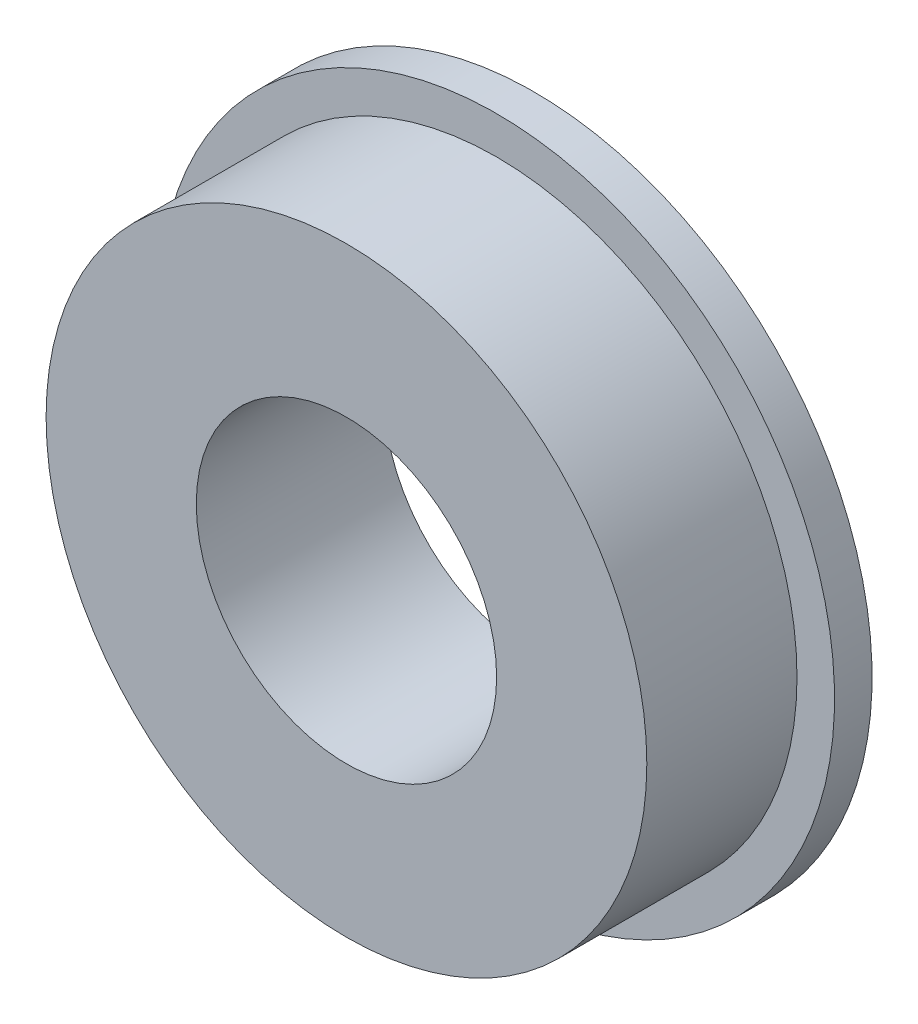
ISO-10303-21;
HEADER;
FILE_DESCRIPTION(('STEP AP214'),'2;1');
FILE_NAME('part.step','',(''),(''),'','','');
FILE_SCHEMA(('AUTOMOTIVE_DESIGN { 1 0 10303 214 1 1 1 1 }'));
ENDSEC;
DATA;
#1=APPLICATION_CONTEXT('core data for automotive mechanical design processes');
#2=APPLICATION_PROTOCOL_DEFINITION('international standard','automotive_design',2000,#1);
#3=PRODUCT_CONTEXT('',#1,'mechanical');
#4=PRODUCT('Part','Part','',(#3));
#5=PRODUCT_RELATED_PRODUCT_CATEGORY('part','',(#4));
#6=PRODUCT_DEFINITION_FORMATION('','',#4);
#7=PRODUCT_DEFINITION_CONTEXT('part definition',#1,'design');
#8=PRODUCT_DEFINITION('design','',#6,#7);
#9=PRODUCT_DEFINITION_SHAPE('','',#8);
#10=(LENGTH_UNIT() NAMED_UNIT(*) SI_UNIT(.MILLI.,.METRE.));
#11=(NAMED_UNIT(*) PLANE_ANGLE_UNIT() SI_UNIT($,.RADIAN.));
#12=(NAMED_UNIT(*) SI_UNIT($,.STERADIAN.) SOLID_ANGLE_UNIT());
#13=UNCERTAINTY_MEASURE_WITH_UNIT(LENGTH_MEASURE(1.E-05),#10,'distance_accuracy_value','');
#14=(GEOMETRIC_REPRESENTATION_CONTEXT(3) GLOBAL_UNCERTAINTY_ASSIGNED_CONTEXT((#13)) GLOBAL_UNIT_ASSIGNED_CONTEXT((#10,
#11,#12)) REPRESENTATION_CONTEXT('',''));
#15=CARTESIAN_POINT('',(0.,0.,0.));
#16=DIRECTION('',(0.,0.,1.));
#17=DIRECTION('',(1.,0.,0.));
#18=AXIS2_PLACEMENT_3D('',#15,#16,#17);
#19=CARTESIAN_POINT('',(0.,0.,0.));
#20=DIRECTION('',(0.,0.,-1.));
#21=DIRECTION('',(-1.,0.,0.));
#22=AXIS2_PLACEMENT_3D('',#19,#20,#21);
#23=CYLINDRICAL_SURFACE('',#22,4.);
#24=CARTESIAN_POINT('',(0.,0.,5.));
#25=DIRECTION('',(0.,0.,-1.));
#26=DIRECTION('',(-1.,0.,0.));
#27=AXIS2_PLACEMENT_3D('',#24,#25,#26);
#28=CIRCLE('',#27,4.);
#29=CARTESIAN_POINT('',(-4.,0.,5.));
#30=VERTEX_POINT('',#29);
#31=EDGE_CURVE('E53',#30,#30,#28,.T.);
#32=ORIENTED_EDGE('',*,*,#31,.F.);
#33=EDGE_LOOP('',(#32));
#34=FACE_BOUND('',#33,.T.);
#35=CARTESIAN_POINT('',(0.,0.,0.));
#36=DIRECTION('',(0.,0.,-1.));
#37=DIRECTION('',(-1.,0.,0.));
#38=AXIS2_PLACEMENT_3D('',#35,#36,#37);
#39=CIRCLE('',#38,4.);
#40=CARTESIAN_POINT('',(-4.,0.,0.));
#41=VERTEX_POINT('',#40);
#42=EDGE_CURVE('E10',#41,#41,#39,.T.);
#43=ORIENTED_EDGE('',*,*,#42,.T.);
#44=EDGE_LOOP('',(#43));
#45=FACE_BOUND('',#44,.T.);
#46=ADVANCED_FACE('F31',(#34,#45),#23,.F.);
#47=CARTESIAN_POINT('',(4.,0.,0.));
#48=DIRECTION('',(0.,0.,1.));
#49=DIRECTION('',(1.,0.,0.));
#50=AXIS2_PLACEMENT_3D('',#47,#48,#49);
#51=PLANE('',#50);
#52=ORIENTED_EDGE('',*,*,#42,.F.);
#53=EDGE_LOOP('',(#52));
#54=FACE_BOUND('',#53,.T.);
#55=CARTESIAN_POINT('',(0.,0.,0.));
#56=DIRECTION('',(0.,0.,-1.));
#57=DIRECTION('',(-1.,0.,0.));
#58=AXIS2_PLACEMENT_3D('',#55,#56,#57);
#59=CIRCLE('',#58,9.);
#60=CARTESIAN_POINT('',(-9.,0.,0.));
#61=VERTEX_POINT('',#60);
#62=EDGE_CURVE('E37',#61,#61,#59,.T.);
#63=ORIENTED_EDGE('',*,*,#62,.T.);
#64=EDGE_LOOP('',(#63));
#65=FACE_BOUND('',#64,.T.);
#66=ADVANCED_FACE('F60',(#54,#65),#51,.F.);
#67=CARTESIAN_POINT('',(0.,0.,0.));
#68=DIRECTION('',(0.,0.,-1.));
#69=DIRECTION('',(-1.,0.,0.));
#70=AXIS2_PLACEMENT_3D('',#67,#68,#69);
#71=CYLINDRICAL_SURFACE('',#70,9.);
#72=ORIENTED_EDGE('',*,*,#62,.F.);
#73=EDGE_LOOP('',(#72));
#74=FACE_BOUND('',#73,.T.);
#75=CARTESIAN_POINT('',(0.,0.,1.));
#76=DIRECTION('',(0.,0.,-1.));
#77=DIRECTION('',(-1.,0.,0.));
#78=AXIS2_PLACEMENT_3D('',#75,#76,#77);
#79=CIRCLE('',#78,9.);
#80=CARTESIAN_POINT('',(-9.,0.,1.));
#81=VERTEX_POINT('',#80);
#82=EDGE_CURVE('E41',#81,#81,#79,.T.);
#83=ORIENTED_EDGE('',*,*,#82,.T.);
#84=EDGE_LOOP('',(#83));
#85=FACE_BOUND('',#84,.T.);
#86=ADVANCED_FACE('F64',(#74,#85),#71,.T.);
#87=CARTESIAN_POINT('',(9.,0.,1.));
#88=DIRECTION('',(0.,0.,-1.));
#89=DIRECTION('',(-1.,0.,0.));
#90=AXIS2_PLACEMENT_3D('',#87,#88,#89);
#91=PLANE('',#90);
#92=ORIENTED_EDGE('',*,*,#82,.F.);
#93=EDGE_LOOP('',(#92));
#94=FACE_BOUND('',#93,.T.);
#95=CARTESIAN_POINT('',(0.,0.,1.));
#96=DIRECTION('',(0.,0.,-1.));
#97=DIRECTION('',(-1.,0.,0.));
#98=AXIS2_PLACEMENT_3D('',#95,#96,#97);
#99=CIRCLE('',#98,8.);
#100=CARTESIAN_POINT('',(-8.,0.,1.));
#101=VERTEX_POINT('',#100);
#102=EDGE_CURVE('E45',#101,#101,#99,.T.);
#103=ORIENTED_EDGE('',*,*,#102,.T.);
#104=EDGE_LOOP('',(#103));
#105=FACE_BOUND('',#104,.T.);
#106=ADVANCED_FACE('F69',(#94,#105),#91,.F.);
#107=CARTESIAN_POINT('',(0.,0.,0.));
#108=DIRECTION('',(0.,0.,-1.));
#109=DIRECTION('',(-1.,0.,0.));
#110=AXIS2_PLACEMENT_3D('',#107,#108,#109);
#111=CYLINDRICAL_SURFACE('',#110,8.);
#112=ORIENTED_EDGE('',*,*,#102,.F.);
#113=EDGE_LOOP('',(#112));
#114=FACE_BOUND('',#113,.T.);
#115=CARTESIAN_POINT('',(0.,0.,5.));
#116=DIRECTION('',(0.,0.,-1.));
#117=DIRECTION('',(-1.,0.,0.));
#118=AXIS2_PLACEMENT_3D('',#115,#116,#117);
#119=CIRCLE('',#118,8.);
#120=CARTESIAN_POINT('',(-8.,0.,5.));
#121=VERTEX_POINT('',#120);
#122=EDGE_CURVE('E50',#121,#121,#119,.T.);
#123=ORIENTED_EDGE('',*,*,#122,.T.);
#124=EDGE_LOOP('',(#123));
#125=FACE_BOUND('',#124,.T.);
#126=ADVANCED_FACE('F75',(#114,#125),#111,.T.);
#127=CARTESIAN_POINT('',(8.,0.,5.));
#128=DIRECTION('',(0.,0.,-1.));
#129=DIRECTION('',(-1.,0.,0.));
#130=AXIS2_PLACEMENT_3D('',#127,#128,#129);
#131=PLANE('',#130);
#132=ORIENTED_EDGE('',*,*,#122,.F.);
#133=EDGE_LOOP('',(#132));
#134=FACE_BOUND('',#133,.T.);
#135=ORIENTED_EDGE('',*,*,#31,.T.);
#136=EDGE_LOOP('',(#135));
#137=FACE_BOUND('',#136,.T.);
#138=ADVANCED_FACE('F57',(#134,#137),#131,.F.);
#139=CLOSED_SHELL('',(#46,#66,#86,#106,#126,#138));
#140=MANIFOLD_SOLID_BREP('B2',#139);
#141=ADVANCED_BREP_SHAPE_REPRESENTATION('',(#18,#140),#14);
#142=SHAPE_DEFINITION_REPRESENTATION(#9,#141);
ENDSEC;
END-ISO-10303-21;
